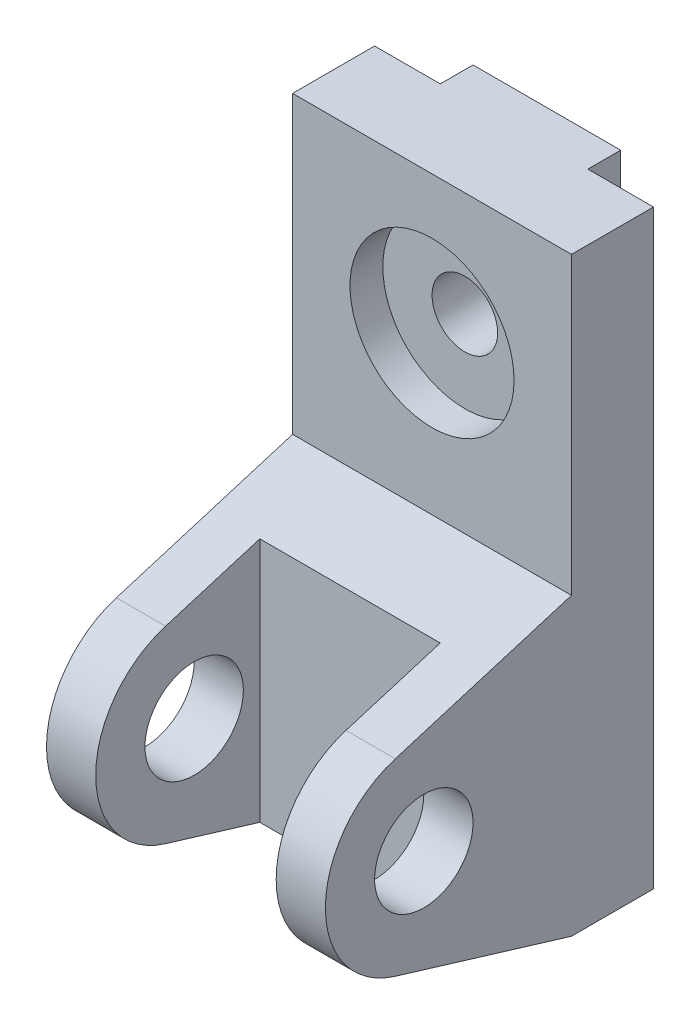
ISO-10303-21;
HEADER;
FILE_DESCRIPTION(('STEP AP214'),'2;1');
FILE_NAME('part.step','',(''),(''),'','','');
FILE_SCHEMA(('AUTOMOTIVE_DESIGN { 1 0 10303 214 1 1 1 1 }'));
ENDSEC;
DATA;
#1=APPLICATION_CONTEXT('core data for automotive mechanical design processes');
#2=APPLICATION_PROTOCOL_DEFINITION('international standard','automotive_design',2000,#1);
#3=PRODUCT_CONTEXT('',#1,'mechanical');
#4=PRODUCT('Part','Part','',(#3));
#5=PRODUCT_RELATED_PRODUCT_CATEGORY('part','',(#4));
#6=PRODUCT_DEFINITION_FORMATION('','',#4);
#7=PRODUCT_DEFINITION_CONTEXT('part definition',#1,'design');
#8=PRODUCT_DEFINITION('design','',#6,#7);
#9=PRODUCT_DEFINITION_SHAPE('','',#8);
#10=(LENGTH_UNIT() NAMED_UNIT(*) SI_UNIT(.MILLI.,.METRE.));
#11=(NAMED_UNIT(*) PLANE_ANGLE_UNIT() SI_UNIT($,.RADIAN.));
#12=(NAMED_UNIT(*) SI_UNIT($,.STERADIAN.) SOLID_ANGLE_UNIT());
#13=UNCERTAINTY_MEASURE_WITH_UNIT(LENGTH_MEASURE(1.E-05),#10,'distance_accuracy_value','');
#14=(GEOMETRIC_REPRESENTATION_CONTEXT(3) GLOBAL_UNCERTAINTY_ASSIGNED_CONTEXT((#13)) GLOBAL_UNIT_ASSIGNED_CONTEXT((#10,
#11,#12)) REPRESENTATION_CONTEXT('',''));
#15=CARTESIAN_POINT('',(0.,0.,0.));
#16=DIRECTION('',(0.,0.,1.));
#17=DIRECTION('',(1.,0.,0.));
#18=AXIS2_PLACEMENT_3D('',#15,#16,#17);
#19=CARTESIAN_POINT('',(-85.,180.,0.));
#20=DIRECTION('',(0.,0.,-1.));
#21=DIRECTION('',(-1.,0.,0.));
#22=AXIS2_PLACEMENT_3D('',#19,#20,#21);
#23=PLANE('',#22);
#24=DIRECTION('',(1.,0.,0.));
#25=VECTOR('',#24,1.);
#26=CARTESIAN_POINT('',(-85.,180.,0.));
#27=LINE('',#26,#25);
#28=CARTESIAN_POINT('',(-85.,180.,0.));
#29=VERTEX_POINT('',#28);
#30=CARTESIAN_POINT('',(-65.,180.,0.));
#31=VERTEX_POINT('',#30);
#32=EDGE_CURVE('E41',#29,#31,#27,.T.);
#33=ORIENTED_EDGE('',*,*,#32,.T.);
#34=DIRECTION('',(0.,-1.,0.));
#35=VECTOR('',#34,1.);
#36=CARTESIAN_POINT('',(-65.,226.097722286464,0.));
#37=LINE('',#36,#35);
#38=CARTESIAN_POINT('',(-65.,0.,0.));
#39=VERTEX_POINT('',#38);
#40=EDGE_CURVE('E169',#31,#39,#37,.T.);
#41=ORIENTED_EDGE('',*,*,#40,.T.);
#42=DIRECTION('',(1.,0.,0.));
#43=VECTOR('',#42,1.);
#44=CARTESIAN_POINT('',(-85.,0.,0.));
#45=LINE('',#44,#43);
#46=CARTESIAN_POINT('',(-85.,0.,0.));
#47=VERTEX_POINT('',#46);
#48=EDGE_CURVE('E247',#47,#39,#45,.T.);
#49=ORIENTED_EDGE('',*,*,#48,.F.);
#50=DIRECTION('',(0.,1.,0.));
#51=VECTOR('',#50,1.);
#52=CARTESIAN_POINT('',(-85.,180.,0.));
#53=LINE('',#52,#51);
#54=EDGE_CURVE('E222',#47,#29,#53,.T.);
#55=ORIENTED_EDGE('',*,*,#54,.T.);
#56=EDGE_LOOP('',(#33,#41,#49,#55));
#57=FACE_BOUND('',#56,.T.);
#58=ADVANCED_FACE('F33',(#57),#23,.T.);
#59=CARTESIAN_POINT('',(-85.,45.,70.));
#60=DIRECTION('',(1.,0.,0.));
#61=DIRECTION('',(0.,0.,-1.));
#62=AXIS2_PLACEMENT_3D('',#59,#60,#61);
#63=CYLINDRICAL_SURFACE('',#62,30.);
#64=DIRECTION('',(1.,0.,0.));
#65=VECTOR('',#64,1.);
#66=CARTESIAN_POINT('',(-85.,73.7082869338697,78.7082869338697));
#67=LINE('',#66,#65);
#68=CARTESIAN_POINT('',(-15.,73.7082869338697,78.7082869338697));
#69=VERTEX_POINT('',#68);
#70=CARTESIAN_POINT('',(0.,73.7082869338697,78.7082869338697));
#71=VERTEX_POINT('',#70);
#72=EDGE_CURVE('E260',#69,#71,#67,.T.);
#73=ORIENTED_EDGE('',*,*,#72,.F.);
#74=CARTESIAN_POINT('',(-15.,45.,70.));
#75=DIRECTION('',(-1.,0.,0.));
#76=DIRECTION('',(0.,0.,1.));
#77=AXIS2_PLACEMENT_3D('',#74,#75,#76);
#78=CIRCLE('',#77,30.);
#79=CARTESIAN_POINT('',(-15.,16.2917130661303,78.7082869338697));
#80=VERTEX_POINT('',#79);
#81=EDGE_CURVE('E56',#69,#80,#78,.F.);
#82=ORIENTED_EDGE('',*,*,#81,.T.);
#83=DIRECTION('',(1.,0.,0.));
#84=VECTOR('',#83,1.);
#85=CARTESIAN_POINT('',(-85.,16.2917130661303,78.7082869338697));
#86=LINE('',#85,#84);
#87=CARTESIAN_POINT('',(0.,16.2917130661303,78.7082869338697));
#88=VERTEX_POINT('',#87);
#89=EDGE_CURVE('E256',#80,#88,#86,.T.);
#90=ORIENTED_EDGE('',*,*,#89,.T.);
#91=CARTESIAN_POINT('',(0.,45.,70.));
#92=DIRECTION('',(1.,0.,0.));
#93=DIRECTION('',(0.,0.,-1.));
#94=AXIS2_PLACEMENT_3D('',#91,#92,#93);
#95=CIRCLE('',#94,30.);
#96=EDGE_CURVE('E234',#71,#88,#95,.T.);
#97=ORIENTED_EDGE('',*,*,#96,.F.);
#98=EDGE_LOOP('',(#73,#82,#90,#97));
#99=FACE_BOUND('',#98,.T.);
#100=ADVANCED_FACE('F287',(#99),#63,.T.);
#101=CARTESIAN_POINT('',(-85.,45.,70.));
#102=DIRECTION('',(1.,0.,0.));
#103=DIRECTION('',(0.,0.,-1.));
#104=AXIS2_PLACEMENT_3D('',#101,#102,#103);
#105=CYLINDRICAL_SURFACE('',#104,15.);
#106=CARTESIAN_POINT('',(0.,45.,70.));
#107=DIRECTION('',(1.,0.,0.));
#108=DIRECTION('',(0.,0.,-1.));
#109=AXIS2_PLACEMENT_3D('',#106,#107,#108);
#110=CIRCLE('',#109,15.);
#111=CARTESIAN_POINT('',(0.,45.,55.));
#112=VERTEX_POINT('',#111);
#113=EDGE_CURVE('E196',#112,#112,#110,.T.);
#114=ORIENTED_EDGE('',*,*,#113,.T.);
#115=EDGE_LOOP('',(#114));
#116=FACE_BOUND('',#115,.T.);
#117=CARTESIAN_POINT('',(-15.,45.,70.));
#118=DIRECTION('',(-1.,0.,0.));
#119=DIRECTION('',(0.,0.,1.));
#120=AXIS2_PLACEMENT_3D('',#117,#118,#119);
#121=CIRCLE('',#120,15.);
#122=CARTESIAN_POINT('',(-15.,45.,85.));
#123=VERTEX_POINT('',#122);
#124=EDGE_CURVE('E178',#123,#123,#121,.F.);
#125=ORIENTED_EDGE('',*,*,#124,.F.);
#126=EDGE_LOOP('',(#125));
#127=FACE_BOUND('',#126,.T.);
#128=ADVANCED_FACE('F284',(#116,#127),#105,.F.);
#129=CARTESIAN_POINT('',(-85.,180.,0.));
#130=DIRECTION('',(0.,1.,0.));
#131=DIRECTION('',(0.,0.,1.));
#132=AXIS2_PLACEMENT_3D('',#129,#130,#131);
#133=PLANE('',#132);
#134=DIRECTION('',(0.,0.,1.));
#135=VECTOR('',#134,1.);
#136=CARTESIAN_POINT('',(0.,180.,0.));
#137=LINE('',#136,#135);
#138=CARTESIAN_POINT('',(0.,180.,0.));
#139=VERTEX_POINT('',#138);
#140=CARTESIAN_POINT('',(0.,180.,25.));
#141=VERTEX_POINT('',#140);
#142=EDGE_CURVE('E200',#139,#141,#137,.T.);
#143=ORIENTED_EDGE('',*,*,#142,.F.);
#144=CARTESIAN_POINT('',(-20.,180.,0.));
#145=VERTEX_POINT('',#144);
#146=EDGE_CURVE('E145',#145,#139,#27,.T.);
#147=ORIENTED_EDGE('',*,*,#146,.F.);
#148=DIRECTION('',(0.,0.,1.));
#149=VECTOR('',#148,1.);
#150=CARTESIAN_POINT('',(-20.,180.,0.));
#151=LINE('',#150,#149);
#152=CARTESIAN_POINT('',(-20.,180.,-9.99999999999998));
#153=VERTEX_POINT('',#152);
#154=EDGE_CURVE('E139',#153,#145,#151,.T.);
#155=ORIENTED_EDGE('',*,*,#154,.F.);
#156=DIRECTION('',(1.,0.,0.));
#157=VECTOR('',#156,1.);
#158=CARTESIAN_POINT('',(-65.,180.,-9.99999999999999));
#159=LINE('',#158,#157);
#160=CARTESIAN_POINT('',(-65.,180.,-9.99999999999999));
#161=VERTEX_POINT('',#160);
#162=EDGE_CURVE('E143',#161,#153,#159,.T.);
#163=ORIENTED_EDGE('',*,*,#162,.F.);
#164=DIRECTION('',(0.,0.,-1.));
#165=VECTOR('',#164,1.);
#166=CARTESIAN_POINT('',(-65.,180.,0.));
#167=LINE('',#166,#165);
#168=EDGE_CURVE('E168',#31,#161,#167,.T.);
#169=ORIENTED_EDGE('',*,*,#168,.F.);
#170=ORIENTED_EDGE('',*,*,#32,.F.);
#171=DIRECTION('',(0.,0.,1.));
#172=VECTOR('',#171,1.);
#173=CARTESIAN_POINT('',(-85.,180.,0.));
#174=LINE('',#173,#172);
#175=CARTESIAN_POINT('',(-85.,180.,25.));
#176=VERTEX_POINT('',#175);
#177=EDGE_CURVE('E203',#29,#176,#174,.T.);
#178=ORIENTED_EDGE('',*,*,#177,.T.);
#179=DIRECTION('',(1.,0.,0.));
#180=VECTOR('',#179,1.);
#181=CARTESIAN_POINT('',(-85.,180.,25.));
#182=LINE('',#181,#180);
#183=EDGE_CURVE('E225',#176,#141,#182,.T.);
#184=ORIENTED_EDGE('',*,*,#183,.T.);
#185=EDGE_LOOP('',(#143,#147,#155,#163,#169,#170,#178,#184));
#186=FACE_BOUND('',#185,.T.);
#187=ADVANCED_FACE('F35',(#186),#133,.T.);
#188=DIRECTION('',(0.,-1.,0.));
#189=VECTOR('',#188,1.);
#190=CARTESIAN_POINT('',(-20.,226.097722286464,0.));
#191=LINE('',#190,#189);
#192=CARTESIAN_POINT('',(-20.,0.,0.));
#193=VERTEX_POINT('',#192);
#194=EDGE_CURVE('E148',#145,#193,#191,.T.);
#195=ORIENTED_EDGE('',*,*,#194,.F.);
#196=ORIENTED_EDGE('',*,*,#146,.T.);
#197=DIRECTION('',(0.,1.,0.));
#198=VECTOR('',#197,1.);
#199=CARTESIAN_POINT('',(0.,180.,0.));
#200=LINE('',#199,#198);
#201=CARTESIAN_POINT('',(0.,0.,0.));
#202=VERTEX_POINT('',#201);
#203=EDGE_CURVE('E207',#202,#139,#200,.T.);
#204=ORIENTED_EDGE('',*,*,#203,.F.);
#205=EDGE_CURVE('E250',#193,#202,#45,.T.);
#206=ORIENTED_EDGE('',*,*,#205,.F.);
#207=EDGE_LOOP('',(#195,#196,#204,#206));
#208=FACE_BOUND('',#207,.T.);
#209=ADVANCED_FACE('F290',(#208),#23,.T.);
#210=CARTESIAN_POINT('',(-85.,0.,0.));
#211=DIRECTION('',(0.,-1.,0.));
#212=DIRECTION('',(0.,0.,-1.));
#213=AXIS2_PLACEMENT_3D('',#210,#211,#212);
#214=PLANE('',#213);
#215=DIRECTION('',(0.,0.,-1.));
#216=VECTOR('',#215,1.);
#217=CARTESIAN_POINT('',(0.,0.,0.));
#218=LINE('',#217,#216);
#219=CARTESIAN_POINT('',(0.,0.,25.));
#220=VERTEX_POINT('',#219);
#221=EDGE_CURVE('E240',#220,#202,#218,.T.);
#222=ORIENTED_EDGE('',*,*,#221,.F.);
#223=DIRECTION('',(1.,0.,0.));
#224=VECTOR('',#223,1.);
#225=CARTESIAN_POINT('',(-85.,0.,25.));
#226=LINE('',#225,#224);
#227=CARTESIAN_POINT('',(-85.,0.,25.));
#228=VERTEX_POINT('',#227);
#229=EDGE_CURVE('E251',#228,#220,#226,.T.);
#230=ORIENTED_EDGE('',*,*,#229,.F.);
#231=DIRECTION('',(0.,0.,-1.));
#232=VECTOR('',#231,1.);
#233=CARTESIAN_POINT('',(-85.,0.,0.));
#234=LINE('',#233,#232);
#235=EDGE_CURVE('E219',#228,#47,#234,.T.);
#236=ORIENTED_EDGE('',*,*,#235,.T.);
#237=ORIENTED_EDGE('',*,*,#48,.T.);
#238=DIRECTION('',(0.,0.,-1.));
#239=VECTOR('',#238,1.);
#240=CARTESIAN_POINT('',(-65.,0.,0.));
#241=LINE('',#240,#239);
#242=CARTESIAN_POINT('',(-65.,0.,-10.));
#243=VERTEX_POINT('',#242);
#244=EDGE_CURVE('E48',#39,#243,#241,.T.);
#245=ORIENTED_EDGE('',*,*,#244,.T.);
#246=DIRECTION('',(1.,0.,0.));
#247=VECTOR('',#246,1.);
#248=CARTESIAN_POINT('',(-65.,0.,-10.));
#249=LINE('',#248,#247);
#250=CARTESIAN_POINT('',(-20.,0.,-10.));
#251=VERTEX_POINT('',#250);
#252=EDGE_CURVE('E163',#243,#251,#249,.T.);
#253=ORIENTED_EDGE('',*,*,#252,.T.);
#254=DIRECTION('',(0.,0.,1.));
#255=VECTOR('',#254,1.);
#256=CARTESIAN_POINT('',(-20.,0.,0.));
#257=LINE('',#256,#255);
#258=EDGE_CURVE('E154',#251,#193,#257,.T.);
#259=ORIENTED_EDGE('',*,*,#258,.T.);
#260=ORIENTED_EDGE('',*,*,#205,.T.);
#261=EDGE_LOOP('',(#222,#230,#236,#237,#245,#253,#259,#260));
#262=FACE_BOUND('',#261,.T.);
#263=ADVANCED_FACE('F300',(#262),#214,.T.);
#264=CARTESIAN_POINT('',(-85.,0.,25.));
#265=DIRECTION('',(0.,-0.956942897795657,0.29027623112899));
#266=DIRECTION('',(0.,-0.29027623112899,-0.956942897795657));
#267=AXIS2_PLACEMENT_3D('',#264,#265,#266);
#268=PLANE('',#267);
#269=DIRECTION('',(0.,-0.29027623112899,-0.956942897795657));
#270=VECTOR('',#269,1.);
#271=CARTESIAN_POINT('',(-70.,0.,25.));
#272=LINE('',#271,#270);
#273=CARTESIAN_POINT('',(-70.,16.2917130661303,78.7082869338697));
#274=VERTEX_POINT('',#273);
#275=CARTESIAN_POINT('',(-70.,7.58342613226058,50.));
#276=VERTEX_POINT('',#275);
#277=EDGE_CURVE('E192',#274,#276,#272,.T.);
#278=ORIENTED_EDGE('',*,*,#277,.F.);
#279=CARTESIAN_POINT('',(-85.,16.2917130661303,78.7082869338697));
#280=VERTEX_POINT('',#279);
#281=EDGE_CURVE('E253',#280,#274,#86,.T.);
#282=ORIENTED_EDGE('',*,*,#281,.F.);
#283=DIRECTION('',(0.,-0.29027623112899,-0.956942897795657));
#284=VECTOR('',#283,1.);
#285=CARTESIAN_POINT('',(-85.,0.,25.));
#286=LINE('',#285,#284);
#287=EDGE_CURVE('E216',#280,#228,#286,.T.);
#288=ORIENTED_EDGE('',*,*,#287,.T.);
#289=ORIENTED_EDGE('',*,*,#229,.T.);
#290=DIRECTION('',(0.,-0.29027623112899,-0.956942897795657));
#291=VECTOR('',#290,1.);
#292=CARTESIAN_POINT('',(0.,0.,25.));
#293=LINE('',#292,#291);
#294=EDGE_CURVE('E237',#88,#220,#293,.T.);
#295=ORIENTED_EDGE('',*,*,#294,.F.);
#296=ORIENTED_EDGE('',*,*,#89,.F.);
#297=DIRECTION('',(0.,-0.29027623112899,-0.956942897795657));
#298=VECTOR('',#297,1.);
#299=CARTESIAN_POINT('',(-15.,0.,25.));
#300=LINE('',#299,#298);
#301=CARTESIAN_POINT('',(-15.,7.58342613226058,50.));
#302=VERTEX_POINT('',#301);
#303=EDGE_CURVE('E184',#80,#302,#300,.T.);
#304=ORIENTED_EDGE('',*,*,#303,.T.);
#305=DIRECTION('',(1.,0.,0.));
#306=VECTOR('',#305,1.);
#307=CARTESIAN_POINT('',(-85.,7.58342613226058,50.));
#308=LINE('',#307,#306);
#309=EDGE_CURVE('E194',#276,#302,#308,.T.);
#310=ORIENTED_EDGE('',*,*,#309,.F.);
#311=EDGE_LOOP('',(#278,#282,#288,#289,#295,#296,#304,#310));
#312=FACE_BOUND('',#311,.T.);
#313=ADVANCED_FACE('F306',(#312),#268,.T.);
#314=CARTESIAN_POINT('',(-70.,45.,70.));
#315=DIRECTION('',(-1.,0.,0.));
#316=DIRECTION('',(0.,0.,1.));
#317=AXIS2_PLACEMENT_3D('',#314,#315,#316);
#318=CIRCLE('',#317,30.);
#319=CARTESIAN_POINT('',(-70.,73.7082869338697,78.7082869338697));
#320=VERTEX_POINT('',#319);
#321=EDGE_CURVE('E190',#320,#274,#318,.F.);
#322=ORIENTED_EDGE('',*,*,#321,.F.);
#323=CARTESIAN_POINT('',(-85.,73.7082869338697,78.7082869338697));
#324=VERTEX_POINT('',#323);
#325=EDGE_CURVE('E257',#324,#320,#67,.T.);
#326=ORIENTED_EDGE('',*,*,#325,.F.);
#327=CARTESIAN_POINT('',(-85.,45.,70.));
#328=DIRECTION('',(1.,0.,0.));
#329=DIRECTION('',(0.,0.,-1.));
#330=AXIS2_PLACEMENT_3D('',#327,#328,#329);
#331=CIRCLE('',#330,30.);
#332=EDGE_CURVE('E213',#324,#280,#331,.T.);
#333=ORIENTED_EDGE('',*,*,#332,.T.);
#334=ORIENTED_EDGE('',*,*,#281,.T.);
#335=EDGE_LOOP('',(#322,#326,#333,#334));
#336=FACE_BOUND('',#335,.T.);
#337=ADVANCED_FACE('F296',(#336),#63,.T.);
#338=CARTESIAN_POINT('',(-85.,90.,25.));
#339=DIRECTION('',(0.,0.956942897795657,0.29027623112899));
#340=DIRECTION('',(0.,-0.29027623112899,0.956942897795657));
#341=AXIS2_PLACEMENT_3D('',#338,#339,#340);
#342=PLANE('',#341);
#343=DIRECTION('',(0.,-0.29027623112899,0.956942897795657));
#344=VECTOR('',#343,1.);
#345=CARTESIAN_POINT('',(-70.,90.,25.));
#346=LINE('',#345,#344);
#347=CARTESIAN_POINT('',(-70.,82.4165738677394,50.));
#348=VERTEX_POINT('',#347);
#349=EDGE_CURVE('E188',#348,#320,#346,.T.);
#350=ORIENTED_EDGE('',*,*,#349,.F.);
#351=DIRECTION('',(-1.,0.,0.));
#352=VECTOR('',#351,1.);
#353=CARTESIAN_POINT('',(-85.,82.4165738677394,50.));
#354=LINE('',#353,#352);
#355=CARTESIAN_POINT('',(-15.,82.4165738677394,50.));
#356=VERTEX_POINT('',#355);
#357=EDGE_CURVE('E11',#356,#348,#354,.T.);
#358=ORIENTED_EDGE('',*,*,#357,.F.);
#359=DIRECTION('',(0.,-0.29027623112899,0.956942897795657));
#360=VECTOR('',#359,1.);
#361=CARTESIAN_POINT('',(-15.,90.,25.));
#362=LINE('',#361,#360);
#363=EDGE_CURVE('E181',#356,#69,#362,.T.);
#364=ORIENTED_EDGE('',*,*,#363,.T.);
#365=ORIENTED_EDGE('',*,*,#72,.T.);
#366=DIRECTION('',(0.,-0.29027623112899,0.956942897795657));
#367=VECTOR('',#366,1.);
#368=CARTESIAN_POINT('',(0.,90.,25.));
#369=LINE('',#368,#367);
#370=CARTESIAN_POINT('',(0.,90.,25.));
#371=VERTEX_POINT('',#370);
#372=EDGE_CURVE('E231',#371,#71,#369,.T.);
#373=ORIENTED_EDGE('',*,*,#372,.F.);
#374=DIRECTION('',(1.,0.,0.));
#375=VECTOR('',#374,1.);
#376=CARTESIAN_POINT('',(-85.,90.,25.));
#377=LINE('',#376,#375);
#378=CARTESIAN_POINT('',(-85.,90.,25.));
#379=VERTEX_POINT('',#378);
#380=EDGE_CURVE('E261',#379,#371,#377,.T.);
#381=ORIENTED_EDGE('',*,*,#380,.F.);
#382=DIRECTION('',(0.,-0.29027623112899,0.956942897795657));
#383=VECTOR('',#382,1.);
#384=CARTESIAN_POINT('',(-85.,90.,25.));
#385=LINE('',#384,#383);
#386=EDGE_CURVE('E210',#379,#324,#385,.T.);
#387=ORIENTED_EDGE('',*,*,#386,.T.);
#388=ORIENTED_EDGE('',*,*,#325,.T.);
#389=EDGE_LOOP('',(#350,#358,#364,#365,#373,#381,#387,#388));
#390=FACE_BOUND('',#389,.T.);
#391=ADVANCED_FACE('F331',(#390),#342,.T.);
#392=CARTESIAN_POINT('',(-85.,180.,25.));
#393=DIRECTION('',(0.,0.,1.));
#394=DIRECTION('',(0.,-1.,0.));
#395=AXIS2_PLACEMENT_3D('',#392,#393,#394);
#396=PLANE('',#395);
#397=CARTESIAN_POINT('',(-42.5,138.,25.));
#398=DIRECTION('',(0.,0.,1.));
#399=DIRECTION('',(1.,0.,0.));
#400=AXIS2_PLACEMENT_3D('',#397,#398,#399);
#401=CIRCLE('',#400,25.000000038);
#402=CARTESIAN_POINT('',(-17.499999962,138.,25.));
#403=VERTEX_POINT('',#402);
#404=EDGE_CURVE('E321',#403,#403,#401,.T.);
#405=ORIENTED_EDGE('',*,*,#404,.F.);
#406=EDGE_LOOP('',(#405));
#407=FACE_BOUND('',#406,.T.);
#408=DIRECTION('',(0.,-1.,0.));
#409=VECTOR('',#408,1.);
#410=CARTESIAN_POINT('',(0.,180.,25.));
#411=LINE('',#410,#409);
#412=EDGE_CURVE('E228',#141,#371,#411,.T.);
#413=ORIENTED_EDGE('',*,*,#412,.F.);
#414=ORIENTED_EDGE('',*,*,#183,.F.);
#415=DIRECTION('',(0.,-1.,0.));
#416=VECTOR('',#415,1.);
#417=CARTESIAN_POINT('',(-85.,180.,25.));
#418=LINE('',#417,#416);
#419=EDGE_CURVE('E206',#176,#379,#418,.T.);
#420=ORIENTED_EDGE('',*,*,#419,.T.);
#421=ORIENTED_EDGE('',*,*,#380,.T.);
#422=EDGE_LOOP('',(#413,#414,#420,#421));
#423=FACE_BOUND('',#422,.T.);
#424=ADVANCED_FACE('F327',(#407,#423),#396,.T.);
#425=CARTESIAN_POINT('',(-85.,45.,70.));
#426=DIRECTION('',(1.,0.,0.));
#427=DIRECTION('',(0.,0.,-1.));
#428=AXIS2_PLACEMENT_3D('',#425,#426,#427);
#429=PLANE('',#428);
#430=CARTESIAN_POINT('',(-85.,45.,70.));
#431=DIRECTION('',(1.,0.,0.));
#432=DIRECTION('',(0.,0.,-1.));
#433=AXIS2_PLACEMENT_3D('',#430,#431,#432);
#434=CIRCLE('',#433,15.);
#435=CARTESIAN_POINT('',(-85.,45.,55.));
#436=VERTEX_POINT('',#435);
#437=EDGE_CURVE('E197',#436,#436,#434,.T.);
#438=ORIENTED_EDGE('',*,*,#437,.T.);
#439=EDGE_LOOP('',(#438));
#440=FACE_BOUND('',#439,.T.);
#441=ORIENTED_EDGE('',*,*,#177,.F.);
#442=ORIENTED_EDGE('',*,*,#54,.F.);
#443=ORIENTED_EDGE('',*,*,#235,.F.);
#444=ORIENTED_EDGE('',*,*,#287,.F.);
#445=ORIENTED_EDGE('',*,*,#332,.F.);
#446=ORIENTED_EDGE('',*,*,#386,.F.);
#447=ORIENTED_EDGE('',*,*,#419,.F.);
#448=EDGE_LOOP('',(#441,#442,#443,#444,#445,#446,#447));
#449=FACE_BOUND('',#448,.T.);
#450=ADVANCED_FACE('F330',(#440,#449),#429,.F.);
#451=CARTESIAN_POINT('',(0.,45.,70.));
#452=DIRECTION('',(1.,0.,0.));
#453=DIRECTION('',(0.,0.,-1.));
#454=AXIS2_PLACEMENT_3D('',#451,#452,#453);
#455=PLANE('',#454);
#456=ORIENTED_EDGE('',*,*,#113,.F.);
#457=EDGE_LOOP('',(#456));
#458=FACE_BOUND('',#457,.T.);
#459=ORIENTED_EDGE('',*,*,#142,.T.);
#460=ORIENTED_EDGE('',*,*,#412,.T.);
#461=ORIENTED_EDGE('',*,*,#372,.T.);
#462=ORIENTED_EDGE('',*,*,#96,.T.);
#463=ORIENTED_EDGE('',*,*,#294,.T.);
#464=ORIENTED_EDGE('',*,*,#221,.T.);
#465=ORIENTED_EDGE('',*,*,#203,.T.);
#466=EDGE_LOOP('',(#459,#460,#461,#462,#463,#464,#465));
#467=FACE_BOUND('',#466,.T.);
#468=ADVANCED_FACE('F282',(#458,#467),#455,.T.);
#469=CARTESIAN_POINT('',(-70.,45.,70.));
#470=DIRECTION('',(-1.,0.,0.));
#471=DIRECTION('',(0.,0.,1.));
#472=AXIS2_PLACEMENT_3D('',#469,#470,#471);
#473=CIRCLE('',#472,15.);
#474=CARTESIAN_POINT('',(-70.,45.,85.));
#475=VERTEX_POINT('',#474);
#476=EDGE_CURVE('E187',#475,#475,#473,.F.);
#477=ORIENTED_EDGE('',*,*,#476,.T.);
#478=EDGE_LOOP('',(#477));
#479=FACE_BOUND('',#478,.T.);
#480=ORIENTED_EDGE('',*,*,#437,.F.);
#481=EDGE_LOOP('',(#480));
#482=FACE_BOUND('',#481,.T.);
#483=ADVANCED_FACE('F268',(#479,#482),#105,.F.);
#484=CARTESIAN_POINT('',(-70.,85.,111.612592622665));
#485=DIRECTION('',(-1.,0.,0.));
#486=DIRECTION('',(0.,0.,1.));
#487=AXIS2_PLACEMENT_3D('',#484,#485,#486);
#488=PLANE('',#487);
#489=ORIENTED_EDGE('',*,*,#277,.T.);
#490=DIRECTION('',(0.,-1.,0.));
#491=VECTOR('',#490,1.);
#492=CARTESIAN_POINT('',(-70.,85.,50.));
#493=LINE('',#492,#491);
#494=EDGE_CURVE('E175',#348,#276,#493,.T.);
#495=ORIENTED_EDGE('',*,*,#494,.F.);
#496=ORIENTED_EDGE('',*,*,#349,.T.);
#497=ORIENTED_EDGE('',*,*,#321,.T.);
#498=EDGE_LOOP('',(#489,#495,#496,#497));
#499=FACE_BOUND('',#498,.T.);
#500=ORIENTED_EDGE('',*,*,#476,.F.);
#501=EDGE_LOOP('',(#500));
#502=FACE_BOUND('',#501,.T.);
#503=ADVANCED_FACE('F271',(#499,#502),#488,.F.);
#504=CARTESIAN_POINT('',(-15.,85.,111.612592622665));
#505=DIRECTION('',(-1.,0.,0.));
#506=DIRECTION('',(0.,0.,1.));
#507=AXIS2_PLACEMENT_3D('',#504,#505,#506);
#508=PLANE('',#507);
#509=ORIENTED_EDGE('',*,*,#81,.F.);
#510=ORIENTED_EDGE('',*,*,#363,.F.);
#511=DIRECTION('',(0.,-1.,0.));
#512=VECTOR('',#511,1.);
#513=CARTESIAN_POINT('',(-15.,85.,50.));
#514=LINE('',#513,#512);
#515=EDGE_CURVE('E174',#356,#302,#514,.T.);
#516=ORIENTED_EDGE('',*,*,#515,.T.);
#517=ORIENTED_EDGE('',*,*,#303,.F.);
#518=EDGE_LOOP('',(#509,#510,#516,#517));
#519=FACE_BOUND('',#518,.T.);
#520=ORIENTED_EDGE('',*,*,#124,.T.);
#521=EDGE_LOOP('',(#520));
#522=FACE_BOUND('',#521,.T.);
#523=ADVANCED_FACE('F273',(#519,#522),#508,.T.);
#524=CARTESIAN_POINT('',(-70.,85.,50.));
#525=DIRECTION('',(0.,0.,-1.));
#526=DIRECTION('',(0.,1.,0.));
#527=AXIS2_PLACEMENT_3D('',#524,#525,#526);
#528=PLANE('',#527);
#529=ORIENTED_EDGE('',*,*,#309,.T.);
#530=ORIENTED_EDGE('',*,*,#515,.F.);
#531=ORIENTED_EDGE('',*,*,#357,.T.);
#532=ORIENTED_EDGE('',*,*,#494,.T.);
#533=EDGE_LOOP('',(#529,#530,#531,#532));
#534=FACE_BOUND('',#533,.T.);
#535=ADVANCED_FACE('F280',(#534),#528,.F.);
#536=CARTESIAN_POINT('',(-65.,226.097722286464,-9.99999999999998));
#537=DIRECTION('',(0.,0.,-1.));
#538=DIRECTION('',(-1.,0.,0.));
#539=AXIS2_PLACEMENT_3D('',#536,#537,#538);
#540=PLANE('',#539);
#541=CARTESIAN_POINT('',(-42.5,138.,-10.));
#542=DIRECTION('',(0.,0.,1.));
#543=DIRECTION('',(1.,0.,0.));
#544=AXIS2_PLACEMENT_3D('',#541,#542,#543);
#545=CIRCLE('',#544,9.99999993899999);
#546=CARTESIAN_POINT('',(-32.500000061,138.,-10.));
#547=VERTEX_POINT('',#546);
#548=EDGE_CURVE('E311',#547,#547,#545,.T.);
#549=ORIENTED_EDGE('',*,*,#548,.T.);
#550=EDGE_LOOP('',(#549));
#551=FACE_BOUND('',#550,.T.);
#552=DIRECTION('',(0.,-1.,0.));
#553=VECTOR('',#552,1.);
#554=CARTESIAN_POINT('',(-65.,226.097722286464,-9.99999999999998));
#555=LINE('',#554,#553);
#556=EDGE_CURVE('E161',#161,#243,#555,.T.);
#557=ORIENTED_EDGE('',*,*,#556,.F.);
#558=ORIENTED_EDGE('',*,*,#162,.T.);
#559=DIRECTION('',(0.,-1.,0.));
#560=VECTOR('',#559,1.);
#561=CARTESIAN_POINT('',(-20.,226.097722286464,-9.99999999999997));
#562=LINE('',#561,#560);
#563=EDGE_CURVE('E149',#153,#251,#562,.T.);
#564=ORIENTED_EDGE('',*,*,#563,.T.);
#565=ORIENTED_EDGE('',*,*,#252,.F.);
#566=EDGE_LOOP('',(#557,#558,#564,#565));
#567=FACE_BOUND('',#566,.T.);
#568=ADVANCED_FACE('F160',(#551,#567),#540,.T.);
#569=CARTESIAN_POINT('',(-20.,226.097722286464,0.));
#570=DIRECTION('',(1.,0.,0.));
#571=DIRECTION('',(0.,0.,-1.));
#572=AXIS2_PLACEMENT_3D('',#569,#570,#571);
#573=PLANE('',#572);
#574=ORIENTED_EDGE('',*,*,#563,.F.);
#575=ORIENTED_EDGE('',*,*,#154,.T.);
#576=ORIENTED_EDGE('',*,*,#194,.T.);
#577=ORIENTED_EDGE('',*,*,#258,.F.);
#578=EDGE_LOOP('',(#574,#575,#576,#577));
#579=FACE_BOUND('',#578,.T.);
#580=ADVANCED_FACE('F152',(#579),#573,.T.);
#581=CARTESIAN_POINT('',(-65.,226.097722286464,0.));
#582=DIRECTION('',(-1.,0.,0.));
#583=DIRECTION('',(0.,0.,1.));
#584=AXIS2_PLACEMENT_3D('',#581,#582,#583);
#585=PLANE('',#584);
#586=ORIENTED_EDGE('',*,*,#40,.F.);
#587=ORIENTED_EDGE('',*,*,#168,.T.);
#588=ORIENTED_EDGE('',*,*,#556,.T.);
#589=ORIENTED_EDGE('',*,*,#244,.F.);
#590=EDGE_LOOP('',(#586,#587,#588,#589));
#591=FACE_BOUND('',#590,.T.);
#592=ADVANCED_FACE('F411',(#591),#585,.T.);
#593=CARTESIAN_POINT('',(-42.5,138.,25.));
#594=DIRECTION('',(0.,0.,1.));
#595=DIRECTION('',(1.,0.,0.));
#596=AXIS2_PLACEMENT_3D('',#593,#594,#595);
#597=CYLINDRICAL_SURFACE('',#596,9.99999993899999);
#598=ORIENTED_EDGE('',*,*,#548,.F.);
#599=EDGE_LOOP('',(#598));
#600=FACE_BOUND('',#599,.T.);
#601=CARTESIAN_POINT('',(-42.5,138.,14.999999934));
#602=DIRECTION('',(0.,0.,1.));
#603=DIRECTION('',(1.,0.,0.));
#604=AXIS2_PLACEMENT_3D('',#601,#602,#603);
#605=CIRCLE('',#604,9.999999939);
#606=CARTESIAN_POINT('',(-32.500000061,138.,14.999999934));
#607=VERTEX_POINT('',#606);
#608=EDGE_CURVE('E315',#607,#607,#605,.T.);
#609=ORIENTED_EDGE('',*,*,#608,.T.);
#610=EDGE_LOOP('',(#609));
#611=FACE_BOUND('',#610,.T.);
#612=ADVANCED_FACE('F420',(#600,#611),#597,.F.);
#613=CARTESIAN_POINT('',(-32.500000061,138.,14.999999934));
#614=DIRECTION('',(0.,0.,-1.));
#615=DIRECTION('',(-1.,0.,0.));
#616=AXIS2_PLACEMENT_3D('',#613,#614,#615);
#617=PLANE('',#616);
#618=ORIENTED_EDGE('',*,*,#608,.F.);
#619=EDGE_LOOP('',(#618));
#620=FACE_BOUND('',#619,.T.);
#621=CARTESIAN_POINT('',(-42.5,138.,14.999999934));
#622=DIRECTION('',(0.,0.,1.));
#623=DIRECTION('',(1.,0.,0.));
#624=AXIS2_PLACEMENT_3D('',#621,#622,#623);
#625=CIRCLE('',#624,25.000000038);
#626=CARTESIAN_POINT('',(-17.499999962,138.,14.999999934));
#627=VERTEX_POINT('',#626);
#628=EDGE_CURVE('E318',#627,#627,#625,.T.);
#629=ORIENTED_EDGE('',*,*,#628,.T.);
#630=EDGE_LOOP('',(#629));
#631=FACE_BOUND('',#630,.T.);
#632=ADVANCED_FACE('F443',(#620,#631),#617,.F.);
#633=CARTESIAN_POINT('',(-42.5,138.,25.));
#634=DIRECTION('',(0.,0.,1.));
#635=DIRECTION('',(1.,0.,0.));
#636=AXIS2_PLACEMENT_3D('',#633,#634,#635);
#637=CYLINDRICAL_SURFACE('',#636,25.000000038);
#638=ORIENTED_EDGE('',*,*,#628,.F.);
#639=EDGE_LOOP('',(#638));
#640=FACE_BOUND('',#639,.T.);
#641=ORIENTED_EDGE('',*,*,#404,.T.);
#642=EDGE_LOOP('',(#641));
#643=FACE_BOUND('',#642,.T.);
#644=ADVANCED_FACE('F325',(#640,#643),#637,.F.);
#645=CLOSED_SHELL('',(#58,#100,#128,#187,#209,#263,#313,#337,#391,#424,#450,#468,#483,#503,#523,
#535,#568,#580,#592,#612,#632,#644));
#646=MANIFOLD_SOLID_BREP('B2',#645);
#647=ADVANCED_BREP_SHAPE_REPRESENTATION('',(#18,#646),#14);
#648=SHAPE_DEFINITION_REPRESENTATION(#9,#647);
ENDSEC;
END-ISO-10303-21;
